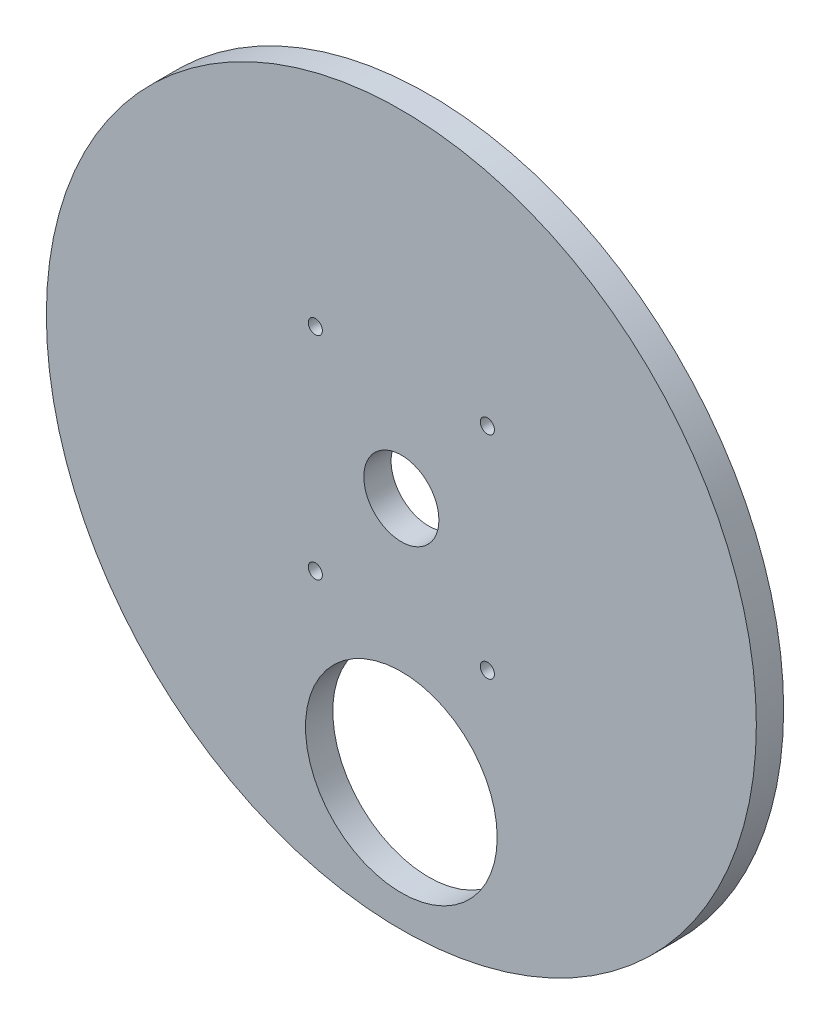
ISO-10303-21;
HEADER;
FILE_DESCRIPTION(('STEP AP214'),'2;1');
FILE_NAME('part.step','',(''),(''),'','','');
FILE_SCHEMA(('AUTOMOTIVE_DESIGN { 1 0 10303 214 1 1 1 1 }'));
ENDSEC;
DATA;
#1=APPLICATION_CONTEXT('core data for automotive mechanical design processes');
#2=APPLICATION_PROTOCOL_DEFINITION('international standard','automotive_design',2000,#1);
#3=PRODUCT_CONTEXT('',#1,'mechanical');
#4=PRODUCT('Part','Part','',(#3));
#5=PRODUCT_RELATED_PRODUCT_CATEGORY('part','',(#4));
#6=PRODUCT_DEFINITION_FORMATION('','',#4);
#7=PRODUCT_DEFINITION_CONTEXT('part definition',#1,'design');
#8=PRODUCT_DEFINITION('design','',#6,#7);
#9=PRODUCT_DEFINITION_SHAPE('','',#8);
#10=(LENGTH_UNIT() NAMED_UNIT(*) SI_UNIT(.MILLI.,.METRE.));
#11=(NAMED_UNIT(*) PLANE_ANGLE_UNIT() SI_UNIT($,.RADIAN.));
#12=(NAMED_UNIT(*) SI_UNIT($,.STERADIAN.) SOLID_ANGLE_UNIT());
#13=UNCERTAINTY_MEASURE_WITH_UNIT(LENGTH_MEASURE(1.E-05),#10,'distance_accuracy_value','');
#14=(GEOMETRIC_REPRESENTATION_CONTEXT(3) GLOBAL_UNCERTAINTY_ASSIGNED_CONTEXT((#13)) GLOBAL_UNIT_ASSIGNED_CONTEXT((#10,
#11,#12)) REPRESENTATION_CONTEXT('',''));
#15=CARTESIAN_POINT('',(0.,0.,0.));
#16=DIRECTION('',(0.,0.,1.));
#17=DIRECTION('',(1.,0.,0.));
#18=AXIS2_PLACEMENT_3D('',#15,#16,#17);
#19=CARTESIAN_POINT('',(0.,0.,12.7));
#20=DIRECTION('',(0.,0.,1.));
#21=DIRECTION('',(1.,0.,0.));
#22=AXIS2_PLACEMENT_3D('',#19,#20,#21);
#23=PLANE('',#22);
#24=CARTESIAN_POINT('',(40.005,49.2125,12.7));
#25=DIRECTION('',(0.,0.,1.));
#26=DIRECTION('',(1.,0.,0.));
#27=AXIS2_PLACEMENT_3D('',#24,#25,#26);
#28=CIRCLE('',#27,3.2893);
#29=CARTESIAN_POINT('',(43.2943,49.2125,12.7));
#30=VERTEX_POINT('',#29);
#31=EDGE_CURVE('E99',#30,#30,#28,.F.);
#32=ORIENTED_EDGE('',*,*,#31,.T.);
#33=EDGE_LOOP('',(#32));
#34=FACE_BOUND('',#33,.T.);
#35=CARTESIAN_POINT('',(-40.005,49.2125,12.7));
#36=DIRECTION('',(0.,0.,1.));
#37=DIRECTION('',(1.,0.,0.));
#38=AXIS2_PLACEMENT_3D('',#35,#36,#37);
#39=CIRCLE('',#38,3.2893);
#40=CARTESIAN_POINT('',(-36.7157,49.2125,12.7));
#41=VERTEX_POINT('',#40);
#42=EDGE_CURVE('E87',#41,#41,#39,.F.);
#43=ORIENTED_EDGE('',*,*,#42,.T.);
#44=EDGE_LOOP('',(#43));
#45=FACE_BOUND('',#44,.T.);
#46=CARTESIAN_POINT('',(-40.005,-49.2125,12.7));
#47=DIRECTION('',(0.,0.,1.));
#48=DIRECTION('',(1.,0.,0.));
#49=AXIS2_PLACEMENT_3D('',#46,#47,#48);
#50=CIRCLE('',#49,3.2893);
#51=CARTESIAN_POINT('',(-36.7157,-49.2125,12.7));
#52=VERTEX_POINT('',#51);
#53=EDGE_CURVE('E75',#52,#52,#50,.F.);
#54=ORIENTED_EDGE('',*,*,#53,.T.);
#55=EDGE_LOOP('',(#54));
#56=FACE_BOUND('',#55,.T.);
#57=CARTESIAN_POINT('',(0.,-114.3,12.7));
#58=DIRECTION('',(0.,0.,1.));
#59=DIRECTION('',(1.,0.,0.));
#60=AXIS2_PLACEMENT_3D('',#57,#58,#59);
#61=CIRCLE('',#60,44.577);
#62=CARTESIAN_POINT('',(44.577,-114.3,12.7));
#63=VERTEX_POINT('',#62);
#64=EDGE_CURVE('E10',#63,#63,#61,.T.);
#65=ORIENTED_EDGE('',*,*,#64,.F.);
#66=EDGE_LOOP('',(#65));
#67=FACE_BOUND('',#66,.T.);
#68=CARTESIAN_POINT('',(0.,0.,12.7));
#69=DIRECTION('',(0.,0.,1.));
#70=DIRECTION('',(1.,0.,0.));
#71=AXIS2_PLACEMENT_3D('',#68,#69,#70);
#72=CIRCLE('',#71,17.4625);
#73=CARTESIAN_POINT('',(17.4625,0.,12.7));
#74=VERTEX_POINT('',#73);
#75=EDGE_CURVE('E40',#74,#74,#72,.T.);
#76=ORIENTED_EDGE('',*,*,#75,.F.);
#77=EDGE_LOOP('',(#76));
#78=FACE_BOUND('',#77,.T.);
#79=CARTESIAN_POINT('',(0.,-8.64302550661053,12.7));
#80=DIRECTION('',(0.,0.,1.));
#81=DIRECTION('',(1.,0.,0.));
#82=AXIS2_PLACEMENT_3D('',#79,#80,#81);
#83=CIRCLE('',#82,165.1);
#84=CARTESIAN_POINT('',(165.1,-8.64302550661053,12.7));
#85=VERTEX_POINT('',#84);
#86=EDGE_CURVE('E45',#85,#85,#83,.T.);
#87=ORIENTED_EDGE('',*,*,#86,.T.);
#88=EDGE_LOOP('',(#87));
#89=FACE_BOUND('',#88,.T.);
#90=CARTESIAN_POINT('',(40.005,-49.2125,12.7));
#91=DIRECTION('',(0.,0.,1.));
#92=DIRECTION('',(1.,0.,0.));
#93=AXIS2_PLACEMENT_3D('',#90,#91,#92);
#94=CIRCLE('',#93,3.2893);
#95=CARTESIAN_POINT('',(43.2943,-49.2125,12.7));
#96=VERTEX_POINT('',#95);
#97=EDGE_CURVE('E63',#96,#96,#94,.F.);
#98=ORIENTED_EDGE('',*,*,#97,.T.);
#99=EDGE_LOOP('',(#98));
#100=FACE_BOUND('',#99,.T.);
#101=ADVANCED_FACE('F32',(#34,#45,#56,#67,#78,#89,#100),#23,.T.);
#102=CARTESIAN_POINT('',(0.,0.,0.));
#103=DIRECTION('',(0.,0.,1.));
#104=DIRECTION('',(1.,0.,0.));
#105=AXIS2_PLACEMENT_3D('',#102,#103,#104);
#106=PLANE('',#105);
#107=CARTESIAN_POINT('',(40.005,49.2125,0.));
#108=DIRECTION('',(0.,0.,-1.));
#109=DIRECTION('',(-1.,0.,0.));
#110=AXIS2_PLACEMENT_3D('',#107,#108,#109);
#111=CIRCLE('',#110,6.35);
#112=CARTESIAN_POINT('',(33.655,49.2125,0.));
#113=VERTEX_POINT('',#112);
#114=EDGE_CURVE('E103',#113,#113,#111,.T.);
#115=ORIENTED_EDGE('',*,*,#114,.F.);
#116=EDGE_LOOP('',(#115));
#117=FACE_BOUND('',#116,.T.);
#118=CARTESIAN_POINT('',(-40.005,49.2125,0.));
#119=DIRECTION('',(0.,0.,-1.));
#120=DIRECTION('',(-1.,0.,0.));
#121=AXIS2_PLACEMENT_3D('',#118,#119,#120);
#122=CIRCLE('',#121,6.35);
#123=CARTESIAN_POINT('',(-46.355,49.2125,0.));
#124=VERTEX_POINT('',#123);
#125=EDGE_CURVE('E91',#124,#124,#122,.T.);
#126=ORIENTED_EDGE('',*,*,#125,.F.);
#127=EDGE_LOOP('',(#126));
#128=FACE_BOUND('',#127,.T.);
#129=CARTESIAN_POINT('',(-40.005,-49.2125,0.));
#130=DIRECTION('',(0.,0.,-1.));
#131=DIRECTION('',(-1.,0.,0.));
#132=AXIS2_PLACEMENT_3D('',#129,#130,#131);
#133=CIRCLE('',#132,6.35);
#134=CARTESIAN_POINT('',(-46.355,-49.2125,0.));
#135=VERTEX_POINT('',#134);
#136=EDGE_CURVE('E79',#135,#135,#133,.T.);
#137=ORIENTED_EDGE('',*,*,#136,.F.);
#138=EDGE_LOOP('',(#137));
#139=FACE_BOUND('',#138,.T.);
#140=CARTESIAN_POINT('',(0.,-8.64302550661053,0.));
#141=DIRECTION('',(0.,0.,1.));
#142=DIRECTION('',(1.,0.,0.));
#143=AXIS2_PLACEMENT_3D('',#140,#141,#142);
#144=CIRCLE('',#143,165.1);
#145=CARTESIAN_POINT('',(165.1,-8.64302550661053,0.));
#146=VERTEX_POINT('',#145);
#147=EDGE_CURVE('E49',#146,#146,#144,.T.);
#148=ORIENTED_EDGE('',*,*,#147,.F.);
#149=EDGE_LOOP('',(#148));
#150=FACE_BOUND('',#149,.T.);
#151=CARTESIAN_POINT('',(0.,0.,0.));
#152=DIRECTION('',(0.,0.,1.));
#153=DIRECTION('',(1.,0.,0.));
#154=AXIS2_PLACEMENT_3D('',#151,#152,#153);
#155=CIRCLE('',#154,17.4625);
#156=CARTESIAN_POINT('',(17.4625,0.,0.));
#157=VERTEX_POINT('',#156);
#158=EDGE_CURVE('E51',#157,#157,#155,.T.);
#159=ORIENTED_EDGE('',*,*,#158,.T.);
#160=EDGE_LOOP('',(#159));
#161=FACE_BOUND('',#160,.T.);
#162=CARTESIAN_POINT('',(0.,-114.3,0.));
#163=DIRECTION('',(0.,0.,1.));
#164=DIRECTION('',(1.,0.,0.));
#165=AXIS2_PLACEMENT_3D('',#162,#163,#164);
#166=CIRCLE('',#165,44.577);
#167=CARTESIAN_POINT('',(44.577,-114.3,0.));
#168=VERTEX_POINT('',#167);
#169=EDGE_CURVE('E36',#168,#168,#166,.T.);
#170=ORIENTED_EDGE('',*,*,#169,.T.);
#171=EDGE_LOOP('',(#170));
#172=FACE_BOUND('',#171,.T.);
#173=CARTESIAN_POINT('',(40.005,-49.2125,0.));
#174=DIRECTION('',(0.,0.,-1.));
#175=DIRECTION('',(-1.,0.,0.));
#176=AXIS2_PLACEMENT_3D('',#173,#174,#175);
#177=CIRCLE('',#176,6.35);
#178=CARTESIAN_POINT('',(33.655,-49.2125,0.));
#179=VERTEX_POINT('',#178);
#180=EDGE_CURVE('E67',#179,#179,#177,.T.);
#181=ORIENTED_EDGE('',*,*,#180,.F.);
#182=EDGE_LOOP('',(#181));
#183=FACE_BOUND('',#182,.T.);
#184=ADVANCED_FACE('F125',(#117,#128,#139,#150,#161,#172,#183),#106,.F.);
#185=CARTESIAN_POINT('',(0.,0.,12.7));
#186=DIRECTION('',(0.,0.,-1.));
#187=DIRECTION('',(-1.,0.,0.));
#188=AXIS2_PLACEMENT_3D('',#185,#186,#187);
#189=CYLINDRICAL_SURFACE('',#188,17.4625);
#190=ORIENTED_EDGE('',*,*,#75,.T.);
#191=EDGE_LOOP('',(#190));
#192=FACE_BOUND('',#191,.T.);
#193=ORIENTED_EDGE('',*,*,#158,.F.);
#194=EDGE_LOOP('',(#193));
#195=FACE_BOUND('',#194,.T.);
#196=ADVANCED_FACE('F128',(#192,#195),#189,.F.);
#197=CARTESIAN_POINT('',(0.,-8.64302550661053,12.7));
#198=DIRECTION('',(0.,0.,-1.));
#199=DIRECTION('',(-1.,0.,0.));
#200=AXIS2_PLACEMENT_3D('',#197,#198,#199);
#201=CYLINDRICAL_SURFACE('',#200,165.1);
#202=ORIENTED_EDGE('',*,*,#86,.F.);
#203=EDGE_LOOP('',(#202));
#204=FACE_BOUND('',#203,.T.);
#205=ORIENTED_EDGE('',*,*,#147,.T.);
#206=EDGE_LOOP('',(#205));
#207=FACE_BOUND('',#206,.T.);
#208=ADVANCED_FACE('F34',(#204,#207),#201,.T.);
#209=CARTESIAN_POINT('',(0.,-114.3,12.7));
#210=DIRECTION('',(0.,0.,-1.));
#211=DIRECTION('',(-1.,0.,0.));
#212=AXIS2_PLACEMENT_3D('',#209,#210,#211);
#213=CYLINDRICAL_SURFACE('',#212,44.577);
#214=ORIENTED_EDGE('',*,*,#64,.T.);
#215=EDGE_LOOP('',(#214));
#216=FACE_BOUND('',#215,.T.);
#217=ORIENTED_EDGE('',*,*,#169,.F.);
#218=EDGE_LOOP('',(#217));
#219=FACE_BOUND('',#218,.T.);
#220=ADVANCED_FACE('F162',(#216,#219),#213,.F.);
#221=CARTESIAN_POINT('',(40.005,-49.2125,0.));
#222=DIRECTION('',(0.,0.,-1.));
#223=DIRECTION('',(-1.,0.,0.));
#224=AXIS2_PLACEMENT_3D('',#221,#222,#223);
#225=CYLINDRICAL_SURFACE('',#224,3.2893);
#226=ORIENTED_EDGE('',*,*,#97,.F.);
#227=EDGE_LOOP('',(#226));
#228=FACE_BOUND('',#227,.T.);
#229=CARTESIAN_POINT('',(40.005,-49.2125,3.81));
#230=DIRECTION('',(0.,0.,-1.));
#231=DIRECTION('',(-1.,0.,0.));
#232=AXIS2_PLACEMENT_3D('',#229,#230,#231);
#233=CIRCLE('',#232,3.2893);
#234=CARTESIAN_POINT('',(36.7157,-49.2125,3.81));
#235=VERTEX_POINT('',#234);
#236=EDGE_CURVE('E66',#235,#235,#233,.T.);
#237=ORIENTED_EDGE('',*,*,#236,.T.);
#238=EDGE_LOOP('',(#237));
#239=FACE_BOUND('',#238,.T.);
#240=ADVANCED_FACE('F151',(#228,#239),#225,.F.);
#241=CARTESIAN_POINT('',(43.2943,-49.2125,3.81));
#242=DIRECTION('',(0.,0.,1.));
#243=DIRECTION('',(1.,0.,0.));
#244=AXIS2_PLACEMENT_3D('',#241,#242,#243);
#245=PLANE('',#244);
#246=ORIENTED_EDGE('',*,*,#236,.F.);
#247=EDGE_LOOP('',(#246));
#248=FACE_BOUND('',#247,.T.);
#249=CARTESIAN_POINT('',(40.005,-49.2125,3.81));
#250=DIRECTION('',(0.,0.,-1.));
#251=DIRECTION('',(-1.,0.,0.));
#252=AXIS2_PLACEMENT_3D('',#249,#250,#251);
#253=CIRCLE('',#252,6.35);
#254=CARTESIAN_POINT('',(33.655,-49.2125,3.81));
#255=VERTEX_POINT('',#254);
#256=EDGE_CURVE('E52',#255,#255,#253,.T.);
#257=ORIENTED_EDGE('',*,*,#256,.T.);
#258=EDGE_LOOP('',(#257));
#259=FACE_BOUND('',#258,.T.);
#260=ADVANCED_FACE('F141',(#248,#259),#245,.F.);
#261=CARTESIAN_POINT('',(40.005,-49.2125,0.));
#262=DIRECTION('',(0.,0.,-1.));
#263=DIRECTION('',(-1.,0.,0.));
#264=AXIS2_PLACEMENT_3D('',#261,#262,#263);
#265=CYLINDRICAL_SURFACE('',#264,6.35);
#266=ORIENTED_EDGE('',*,*,#256,.F.);
#267=EDGE_LOOP('',(#266));
#268=FACE_BOUND('',#267,.T.);
#269=ORIENTED_EDGE('',*,*,#180,.T.);
#270=EDGE_LOOP('',(#269));
#271=FACE_BOUND('',#270,.T.);
#272=ADVANCED_FACE('F138',(#268,#271),#265,.F.);
#273=CARTESIAN_POINT('',(-40.005,-49.2125,0.));
#274=DIRECTION('',(0.,0.,-1.));
#275=DIRECTION('',(-1.,0.,0.));
#276=AXIS2_PLACEMENT_3D('',#273,#274,#275);
#277=CYLINDRICAL_SURFACE('',#276,3.2893);
#278=ORIENTED_EDGE('',*,*,#53,.F.);
#279=EDGE_LOOP('',(#278));
#280=FACE_BOUND('',#279,.T.);
#281=CARTESIAN_POINT('',(-40.005,-49.2125,3.81));
#282=DIRECTION('',(0.,0.,-1.));
#283=DIRECTION('',(-1.,0.,0.));
#284=AXIS2_PLACEMENT_3D('',#281,#282,#283);
#285=CIRCLE('',#284,3.2893);
#286=CARTESIAN_POINT('',(-43.2943,-49.2125,3.81));
#287=VERTEX_POINT('',#286);
#288=EDGE_CURVE('E78',#287,#287,#285,.T.);
#289=ORIENTED_EDGE('',*,*,#288,.T.);
#290=EDGE_LOOP('',(#289));
#291=FACE_BOUND('',#290,.T.);
#292=ADVANCED_FACE('F140',(#280,#291),#277,.F.);
#293=CARTESIAN_POINT('',(-36.7157,-49.2125,3.81));
#294=DIRECTION('',(0.,0.,1.));
#295=DIRECTION('',(1.,0.,0.));
#296=AXIS2_PLACEMENT_3D('',#293,#294,#295);
#297=PLANE('',#296);
#298=ORIENTED_EDGE('',*,*,#288,.F.);
#299=EDGE_LOOP('',(#298));
#300=FACE_BOUND('',#299,.T.);
#301=CARTESIAN_POINT('',(-40.005,-49.2125,3.81));
#302=DIRECTION('',(0.,0.,-1.));
#303=DIRECTION('',(-1.,0.,0.));
#304=AXIS2_PLACEMENT_3D('',#301,#302,#303);
#305=CIRCLE('',#304,6.35);
#306=CARTESIAN_POINT('',(-46.355,-49.2125,3.81));
#307=VERTEX_POINT('',#306);
#308=EDGE_CURVE('E70',#307,#307,#305,.T.);
#309=ORIENTED_EDGE('',*,*,#308,.T.);
#310=EDGE_LOOP('',(#309));
#311=FACE_BOUND('',#310,.T.);
#312=ADVANCED_FACE('F148',(#300,#311),#297,.F.);
#313=CARTESIAN_POINT('',(-40.005,-49.2125,0.));
#314=DIRECTION('',(0.,0.,-1.));
#315=DIRECTION('',(-1.,0.,0.));
#316=AXIS2_PLACEMENT_3D('',#313,#314,#315);
#317=CYLINDRICAL_SURFACE('',#316,6.35);
#318=ORIENTED_EDGE('',*,*,#308,.F.);
#319=EDGE_LOOP('',(#318));
#320=FACE_BOUND('',#319,.T.);
#321=ORIENTED_EDGE('',*,*,#136,.T.);
#322=EDGE_LOOP('',(#321));
#323=FACE_BOUND('',#322,.T.);
#324=ADVANCED_FACE('F184',(#320,#323),#317,.F.);
#325=CARTESIAN_POINT('',(-40.005,49.2125,0.));
#326=DIRECTION('',(0.,0.,-1.));
#327=DIRECTION('',(-1.,0.,0.));
#328=AXIS2_PLACEMENT_3D('',#325,#326,#327);
#329=CYLINDRICAL_SURFACE('',#328,3.2893);
#330=ORIENTED_EDGE('',*,*,#42,.F.);
#331=EDGE_LOOP('',(#330));
#332=FACE_BOUND('',#331,.T.);
#333=CARTESIAN_POINT('',(-40.005,49.2125,3.81));
#334=DIRECTION('',(0.,0.,-1.));
#335=DIRECTION('',(-1.,0.,0.));
#336=AXIS2_PLACEMENT_3D('',#333,#334,#335);
#337=CIRCLE('',#336,3.2893);
#338=CARTESIAN_POINT('',(-43.2943,49.2125,3.81));
#339=VERTEX_POINT('',#338);
#340=EDGE_CURVE('E90',#339,#339,#337,.T.);
#341=ORIENTED_EDGE('',*,*,#340,.T.);
#342=EDGE_LOOP('',(#341));
#343=FACE_BOUND('',#342,.T.);
#344=ADVANCED_FACE('F187',(#332,#343),#329,.F.);
#345=CARTESIAN_POINT('',(-36.7157,49.2125,3.81));
#346=DIRECTION('',(0.,0.,1.));
#347=DIRECTION('',(1.,0.,0.));
#348=AXIS2_PLACEMENT_3D('',#345,#346,#347);
#349=PLANE('',#348);
#350=ORIENTED_EDGE('',*,*,#340,.F.);
#351=EDGE_LOOP('',(#350));
#352=FACE_BOUND('',#351,.T.);
#353=CARTESIAN_POINT('',(-40.005,49.2125,3.81));
#354=DIRECTION('',(0.,0.,-1.));
#355=DIRECTION('',(-1.,0.,0.));
#356=AXIS2_PLACEMENT_3D('',#353,#354,#355);
#357=CIRCLE('',#356,6.35);
#358=CARTESIAN_POINT('',(-46.355,49.2125,3.81));
#359=VERTEX_POINT('',#358);
#360=EDGE_CURVE('E82',#359,#359,#357,.T.);
#361=ORIENTED_EDGE('',*,*,#360,.T.);
#362=EDGE_LOOP('',(#361));
#363=FACE_BOUND('',#362,.T.);
#364=ADVANCED_FACE('F195',(#352,#363),#349,.F.);
#365=CARTESIAN_POINT('',(-40.005,49.2125,0.));
#366=DIRECTION('',(0.,0.,-1.));
#367=DIRECTION('',(-1.,0.,0.));
#368=AXIS2_PLACEMENT_3D('',#365,#366,#367);
#369=CYLINDRICAL_SURFACE('',#368,6.35);
#370=ORIENTED_EDGE('',*,*,#360,.F.);
#371=EDGE_LOOP('',(#370));
#372=FACE_BOUND('',#371,.T.);
#373=ORIENTED_EDGE('',*,*,#125,.T.);
#374=EDGE_LOOP('',(#373));
#375=FACE_BOUND('',#374,.T.);
#376=ADVANCED_FACE('F192',(#372,#375),#369,.F.);
#377=CARTESIAN_POINT('',(40.005,49.2125,0.));
#378=DIRECTION('',(0.,0.,-1.));
#379=DIRECTION('',(-1.,0.,0.));
#380=AXIS2_PLACEMENT_3D('',#377,#378,#379);
#381=CYLINDRICAL_SURFACE('',#380,3.2893);
#382=ORIENTED_EDGE('',*,*,#31,.F.);
#383=EDGE_LOOP('',(#382));
#384=FACE_BOUND('',#383,.T.);
#385=CARTESIAN_POINT('',(40.005,49.2125,3.81));
#386=DIRECTION('',(0.,0.,-1.));
#387=DIRECTION('',(-1.,0.,0.));
#388=AXIS2_PLACEMENT_3D('',#385,#386,#387);
#389=CIRCLE('',#388,3.2893);
#390=CARTESIAN_POINT('',(36.7157,49.2125,3.81));
#391=VERTEX_POINT('',#390);
#392=EDGE_CURVE('E102',#391,#391,#389,.T.);
#393=ORIENTED_EDGE('',*,*,#392,.T.);
#394=EDGE_LOOP('',(#393));
#395=FACE_BOUND('',#394,.T.);
#396=ADVANCED_FACE('F111',(#384,#395),#381,.F.);
#397=CARTESIAN_POINT('',(43.2943,49.2125,3.81));
#398=DIRECTION('',(0.,0.,1.));
#399=DIRECTION('',(1.,0.,0.));
#400=AXIS2_PLACEMENT_3D('',#397,#398,#399);
#401=PLANE('',#400);
#402=ORIENTED_EDGE('',*,*,#392,.F.);
#403=EDGE_LOOP('',(#402));
#404=FACE_BOUND('',#403,.T.);
#405=CARTESIAN_POINT('',(40.005,49.2125,3.81));
#406=DIRECTION('',(0.,0.,-1.));
#407=DIRECTION('',(-1.,0.,0.));
#408=AXIS2_PLACEMENT_3D('',#405,#406,#407);
#409=CIRCLE('',#408,6.35);
#410=CARTESIAN_POINT('',(33.655,49.2125,3.81));
#411=VERTEX_POINT('',#410);
#412=EDGE_CURVE('E94',#411,#411,#409,.T.);
#413=ORIENTED_EDGE('',*,*,#412,.T.);
#414=EDGE_LOOP('',(#413));
#415=FACE_BOUND('',#414,.T.);
#416=ADVANCED_FACE('F113',(#404,#415),#401,.F.);
#417=CARTESIAN_POINT('',(40.005,49.2125,0.));
#418=DIRECTION('',(0.,0.,-1.));
#419=DIRECTION('',(-1.,0.,0.));
#420=AXIS2_PLACEMENT_3D('',#417,#418,#419);
#421=CYLINDRICAL_SURFACE('',#420,6.35);
#422=ORIENTED_EDGE('',*,*,#412,.F.);
#423=EDGE_LOOP('',(#422));
#424=FACE_BOUND('',#423,.T.);
#425=ORIENTED_EDGE('',*,*,#114,.T.);
#426=EDGE_LOOP('',(#425));
#427=FACE_BOUND('',#426,.T.);
#428=ADVANCED_FACE('F116',(#424,#427),#421,.F.);
#429=CLOSED_SHELL('',(#101,#184,#196,#208,#220,#240,#260,#272,#292,#312,#324,#344,#364,#376,
#396,#416,#428));
#430=MANIFOLD_SOLID_BREP('B2',#429);
#431=ADVANCED_BREP_SHAPE_REPRESENTATION('',(#18,#430),#14);
#432=SHAPE_DEFINITION_REPRESENTATION(#9,#431);
ENDSEC;
END-ISO-10303-21;
